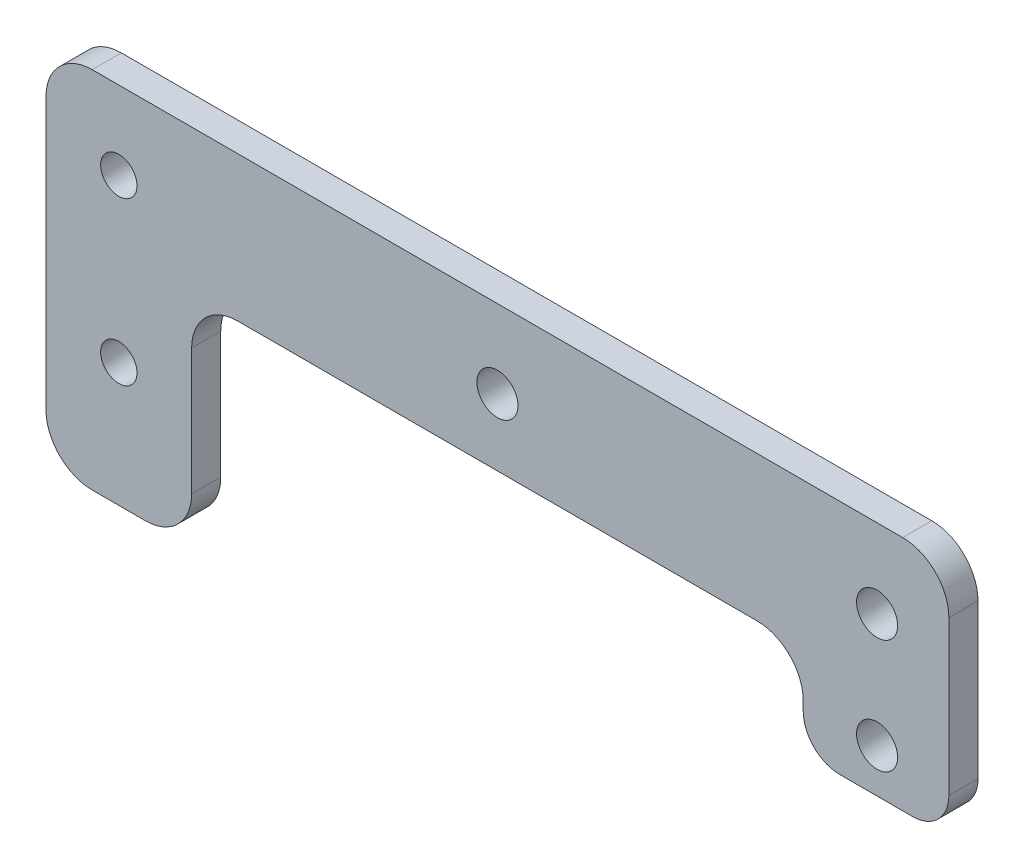
ISO-10303-21;
HEADER;
FILE_DESCRIPTION(('STEP AP214'),'2;1');
FILE_NAME('part.step','',(''),(''),'','','');
FILE_SCHEMA(('AUTOMOTIVE_DESIGN { 1 0 10303 214 1 1 1 1 }'));
ENDSEC;
DATA;
#1=APPLICATION_CONTEXT('core data for automotive mechanical design processes');
#2=APPLICATION_PROTOCOL_DEFINITION('international standard','automotive_design',2000,#1);
#3=PRODUCT_CONTEXT('',#1,'mechanical');
#4=PRODUCT('Part','Part','',(#3));
#5=PRODUCT_RELATED_PRODUCT_CATEGORY('part','',(#4));
#6=PRODUCT_DEFINITION_FORMATION('','',#4);
#7=PRODUCT_DEFINITION_CONTEXT('part definition',#1,'design');
#8=PRODUCT_DEFINITION('design','',#6,#7);
#9=PRODUCT_DEFINITION_SHAPE('','',#8);
#10=(LENGTH_UNIT() NAMED_UNIT(*) SI_UNIT(.MILLI.,.METRE.));
#11=(NAMED_UNIT(*) PLANE_ANGLE_UNIT() SI_UNIT($,.RADIAN.));
#12=(NAMED_UNIT(*) SI_UNIT($,.STERADIAN.) SOLID_ANGLE_UNIT());
#13=UNCERTAINTY_MEASURE_WITH_UNIT(LENGTH_MEASURE(1.E-05),#10,'distance_accuracy_value','');
#14=(GEOMETRIC_REPRESENTATION_CONTEXT(3) GLOBAL_UNCERTAINTY_ASSIGNED_CONTEXT((#13)) GLOBAL_UNIT_ASSIGNED_CONTEXT((#10,
#11,#12)) REPRESENTATION_CONTEXT('',''));
#15=CARTESIAN_POINT('',(0.,0.,0.));
#16=DIRECTION('',(0.,0.,1.));
#17=DIRECTION('',(1.,0.,0.));
#18=AXIS2_PLACEMENT_3D('',#15,#16,#17);
#19=CARTESIAN_POINT('',(0.,26.6043563241678,4.));
#20=DIRECTION('',(0.,1.,0.));
#21=DIRECTION('',(-1.,0.,0.));
#22=AXIS2_PLACEMENT_3D('',#19,#20,#21);
#23=PLANE('',#22);
#24=DIRECTION('',(1.,0.,0.));
#25=VECTOR('',#24,1.);
#26=CARTESIAN_POINT('',(0.,26.6043563241678,0.));
#27=LINE('',#26,#25);
#28=CARTESIAN_POINT('',(6.39337520482172,26.6043563241678,0.));
#29=VERTEX_POINT('',#28);
#30=CARTESIAN_POINT('',(117.693375204822,26.6043563241678,0.));
#31=VERTEX_POINT('',#30);
#32=EDGE_CURVE('E200',#29,#31,#27,.T.);
#33=ORIENTED_EDGE('',*,*,#32,.F.);
#34=DIRECTION('',(0.,0.,-1.));
#35=VECTOR('',#34,1.);
#36=CARTESIAN_POINT('',(6.39337520482172,26.6043563241678,4.));
#37=LINE('',#36,#35);
#38=CARTESIAN_POINT('',(6.39337520482172,26.6043563241678,4.));
#39=VERTEX_POINT('',#38);
#40=EDGE_CURVE('E11',#39,#29,#37,.T.);
#41=ORIENTED_EDGE('',*,*,#40,.F.);
#42=DIRECTION('',(1.,0.,0.));
#43=VECTOR('',#42,1.);
#44=CARTESIAN_POINT('',(0.,26.6043563241678,4.));
#45=LINE('',#44,#43);
#46=CARTESIAN_POINT('',(117.693375204822,26.6043563241678,4.));
#47=VERTEX_POINT('',#46);
#48=EDGE_CURVE('E300',#39,#47,#45,.T.);
#49=ORIENTED_EDGE('',*,*,#48,.T.);
#50=DIRECTION('',(0.,0.,-1.));
#51=VECTOR('',#50,1.);
#52=CARTESIAN_POINT('',(117.693375204822,26.6043563241678,4.));
#53=LINE('',#52,#51);
#54=EDGE_CURVE('E116',#47,#31,#53,.T.);
#55=ORIENTED_EDGE('',*,*,#54,.T.);
#56=EDGE_LOOP('',(#33,#41,#49,#55));
#57=FACE_BOUND('',#56,.T.);
#58=ADVANCED_FACE('F41',(#57),#23,.T.);
#59=CARTESIAN_POINT('',(6.39337520482172,20.2543563241678,4.));
#60=DIRECTION('',(0.,0.,-1.));
#61=DIRECTION('',(-1.,0.,0.));
#62=AXIS2_PLACEMENT_3D('',#59,#60,#61);
#63=CYLINDRICAL_SURFACE('',#62,6.35);
#64=CARTESIAN_POINT('',(6.39337520482172,20.2543563241678,0.));
#65=DIRECTION('',(0.,0.,1.));
#66=DIRECTION('',(1.,0.,0.));
#67=AXIS2_PLACEMENT_3D('',#64,#65,#66);
#68=CIRCLE('',#67,6.35);
#69=CARTESIAN_POINT('',(0.0433752048217246,20.2543563241678,0.));
#70=VERTEX_POINT('',#69);
#71=EDGE_CURVE('E203',#29,#70,#68,.T.);
#72=ORIENTED_EDGE('',*,*,#71,.T.);
#73=DIRECTION('',(0.,0.,-1.));
#74=VECTOR('',#73,1.);
#75=CARTESIAN_POINT('',(0.0433752048217246,20.2543563241678,4.));
#76=LINE('',#75,#74);
#77=CARTESIAN_POINT('',(0.0433752048217246,20.2543563241678,4.));
#78=VERTEX_POINT('',#77);
#79=EDGE_CURVE('E50',#78,#70,#76,.T.);
#80=ORIENTED_EDGE('',*,*,#79,.F.);
#81=CARTESIAN_POINT('',(6.39337520482172,20.2543563241678,4.));
#82=DIRECTION('',(0.,0.,1.));
#83=DIRECTION('',(1.,0.,0.));
#84=AXIS2_PLACEMENT_3D('',#81,#82,#83);
#85=CIRCLE('',#84,6.35);
#86=EDGE_CURVE('E296',#39,#78,#85,.T.);
#87=ORIENTED_EDGE('',*,*,#86,.F.);
#88=ORIENTED_EDGE('',*,*,#40,.T.);
#89=EDGE_LOOP('',(#72,#80,#87,#88));
#90=FACE_BOUND('',#89,.T.);
#91=ADVANCED_FACE('F283',(#90),#63,.T.);
#92=CARTESIAN_POINT('',(0.0433752048217246,0.,4.));
#93=DIRECTION('',(-1.,0.,0.));
#94=DIRECTION('',(0.,-1.,0.));
#95=AXIS2_PLACEMENT_3D('',#92,#93,#94);
#96=PLANE('',#95);
#97=DIRECTION('',(0.,1.,0.));
#98=VECTOR('',#97,1.);
#99=CARTESIAN_POINT('',(0.0433752048217246,0.,0.));
#100=LINE('',#99,#98);
#101=CARTESIAN_POINT('',(0.0433752048217247,-17.0456436758322,0.));
#102=VERTEX_POINT('',#101);
#103=EDGE_CURVE('E206',#102,#70,#100,.T.);
#104=ORIENTED_EDGE('',*,*,#103,.F.);
#105=DIRECTION('',(0.,0.,-1.));
#106=VECTOR('',#105,1.);
#107=CARTESIAN_POINT('',(0.0433752048217247,-17.0456436758322,4.));
#108=LINE('',#107,#106);
#109=CARTESIAN_POINT('',(0.0433752048217247,-17.0456436758322,4.));
#110=VERTEX_POINT('',#109);
#111=EDGE_CURVE('E273',#110,#102,#108,.T.);
#112=ORIENTED_EDGE('',*,*,#111,.F.);
#113=DIRECTION('',(0.,1.,0.));
#114=VECTOR('',#113,1.);
#115=CARTESIAN_POINT('',(0.0433752048217246,0.,4.));
#116=LINE('',#115,#114);
#117=EDGE_CURVE('E280',#110,#78,#116,.T.);
#118=ORIENTED_EDGE('',*,*,#117,.T.);
#119=ORIENTED_EDGE('',*,*,#79,.T.);
#120=EDGE_LOOP('',(#104,#112,#118,#119));
#121=FACE_BOUND('',#120,.T.);
#122=ADVANCED_FACE('F278',(#121),#96,.T.);
#123=CARTESIAN_POINT('',(6.39337520482172,-17.0456436758322,4.));
#124=DIRECTION('',(0.,0.,-1.));
#125=DIRECTION('',(-1.,0.,0.));
#126=AXIS2_PLACEMENT_3D('',#123,#124,#125);
#127=CYLINDRICAL_SURFACE('',#126,6.35);
#128=CARTESIAN_POINT('',(6.39337520482172,-17.0456436758322,0.));
#129=DIRECTION('',(0.,0.,1.));
#130=DIRECTION('',(1.,0.,0.));
#131=AXIS2_PLACEMENT_3D('',#128,#129,#130);
#132=CIRCLE('',#131,6.35);
#133=CARTESIAN_POINT('',(6.39337520482172,-23.3956436758322,0.));
#134=VERTEX_POINT('',#133);
#135=EDGE_CURVE('E209',#134,#102,#132,.F.);
#136=ORIENTED_EDGE('',*,*,#135,.F.);
#137=DIRECTION('',(0.,0.,-1.));
#138=VECTOR('',#137,1.);
#139=CARTESIAN_POINT('',(6.39337520482172,-23.3956436758322,4.));
#140=LINE('',#139,#138);
#141=CARTESIAN_POINT('',(6.39337520482172,-23.3956436758322,4.));
#142=VERTEX_POINT('',#141);
#143=EDGE_CURVE('E271',#142,#134,#140,.T.);
#144=ORIENTED_EDGE('',*,*,#143,.F.);
#145=CARTESIAN_POINT('',(6.39337520482172,-17.0456436758322,4.));
#146=DIRECTION('',(0.,0.,1.));
#147=DIRECTION('',(1.,0.,0.));
#148=AXIS2_PLACEMENT_3D('',#145,#146,#147);
#149=CIRCLE('',#148,6.35);
#150=EDGE_CURVE('E294',#142,#110,#149,.F.);
#151=ORIENTED_EDGE('',*,*,#150,.T.);
#152=ORIENTED_EDGE('',*,*,#111,.T.);
#153=EDGE_LOOP('',(#136,#144,#151,#152));
#154=FACE_BOUND('',#153,.T.);
#155=ADVANCED_FACE('F290',(#154),#127,.T.);
#156=CARTESIAN_POINT('',(0.,-23.3956436758322,4.));
#157=DIRECTION('',(0.,1.,0.));
#158=DIRECTION('',(0.,0.,1.));
#159=AXIS2_PLACEMENT_3D('',#156,#157,#158);
#160=PLANE('',#159);
#161=DIRECTION('',(1.,0.,0.));
#162=VECTOR('',#161,1.);
#163=CARTESIAN_POINT('',(0.,-23.3956436758322,0.));
#164=LINE('',#163,#162);
#165=CARTESIAN_POINT('',(13.6933752048217,-23.3956436758322,0.));
#166=VERTEX_POINT('',#165);
#167=EDGE_CURVE('E212',#134,#166,#164,.T.);
#168=ORIENTED_EDGE('',*,*,#167,.T.);
#169=DIRECTION('',(0.,0.,-1.));
#170=VECTOR('',#169,1.);
#171=CARTESIAN_POINT('',(13.6933752048217,-23.3956436758322,4.));
#172=LINE('',#171,#170);
#173=CARTESIAN_POINT('',(13.6933752048217,-23.3956436758322,4.));
#174=VERTEX_POINT('',#173);
#175=EDGE_CURVE('E268',#174,#166,#172,.T.);
#176=ORIENTED_EDGE('',*,*,#175,.F.);
#177=DIRECTION('',(1.,0.,0.));
#178=VECTOR('',#177,1.);
#179=CARTESIAN_POINT('',(0.,-23.3956436758322,4.));
#180=LINE('',#179,#178);
#181=EDGE_CURVE('E298',#142,#174,#180,.T.);
#182=ORIENTED_EDGE('',*,*,#181,.F.);
#183=ORIENTED_EDGE('',*,*,#143,.T.);
#184=EDGE_LOOP('',(#168,#176,#182,#183));
#185=FACE_BOUND('',#184,.T.);
#186=ADVANCED_FACE('F423',(#185),#160,.F.);
#187=CARTESIAN_POINT('',(13.6933752048217,-17.0456436758322,4.));
#188=DIRECTION('',(0.,0.,-1.));
#189=DIRECTION('',(-1.,0.,0.));
#190=AXIS2_PLACEMENT_3D('',#187,#188,#189);
#191=CYLINDRICAL_SURFACE('',#190,6.35);
#192=CARTESIAN_POINT('',(13.6933752048217,-17.0456436758322,0.));
#193=DIRECTION('',(0.,0.,1.));
#194=DIRECTION('',(1.,0.,0.));
#195=AXIS2_PLACEMENT_3D('',#192,#193,#194);
#196=CIRCLE('',#195,6.35);
#197=CARTESIAN_POINT('',(20.0433752048217,-17.0456436758322,0.));
#198=VERTEX_POINT('',#197);
#199=EDGE_CURVE('E215',#166,#198,#196,.T.);
#200=ORIENTED_EDGE('',*,*,#199,.T.);
#201=DIRECTION('',(0.,0.,-1.));
#202=VECTOR('',#201,1.);
#203=CARTESIAN_POINT('',(20.0433752048217,-17.0456436758322,4.));
#204=LINE('',#203,#202);
#205=CARTESIAN_POINT('',(20.0433752048217,-17.0456436758322,4.));
#206=VERTEX_POINT('',#205);
#207=EDGE_CURVE('E266',#206,#198,#204,.T.);
#208=ORIENTED_EDGE('',*,*,#207,.F.);
#209=CARTESIAN_POINT('',(13.6933752048217,-17.0456436758322,4.));
#210=DIRECTION('',(0.,0.,1.));
#211=DIRECTION('',(1.,0.,0.));
#212=AXIS2_PLACEMENT_3D('',#209,#210,#211);
#213=CIRCLE('',#212,6.35);
#214=EDGE_CURVE('E305',#174,#206,#213,.T.);
#215=ORIENTED_EDGE('',*,*,#214,.F.);
#216=ORIENTED_EDGE('',*,*,#175,.T.);
#217=EDGE_LOOP('',(#200,#208,#215,#216));
#218=FACE_BOUND('',#217,.T.);
#219=ADVANCED_FACE('F419',(#218),#191,.T.);
#220=CARTESIAN_POINT('',(20.0433752048217,0.,4.));
#221=DIRECTION('',(1.,0.,0.));
#222=DIRECTION('',(0.,1.,0.));
#223=AXIS2_PLACEMENT_3D('',#220,#221,#222);
#224=PLANE('',#223);
#225=DIRECTION('',(0.,-1.,0.));
#226=VECTOR('',#225,1.);
#227=CARTESIAN_POINT('',(20.0433752048217,0.,0.));
#228=LINE('',#227,#226);
#229=CARTESIAN_POINT('',(20.0433752048217,0.349416953919621,0.));
#230=VERTEX_POINT('',#229);
#231=EDGE_CURVE('E218',#230,#198,#228,.T.);
#232=ORIENTED_EDGE('',*,*,#231,.F.);
#233=DIRECTION('',(0.,0.,-1.));
#234=VECTOR('',#233,1.);
#235=CARTESIAN_POINT('',(20.0433752048217,0.349416953919621,4.));
#236=LINE('',#235,#234);
#237=CARTESIAN_POINT('',(20.0433752048217,0.349416953919621,4.));
#238=VERTEX_POINT('',#237);
#239=EDGE_CURVE('E264',#238,#230,#236,.T.);
#240=ORIENTED_EDGE('',*,*,#239,.F.);
#241=DIRECTION('',(0.,-1.,0.));
#242=VECTOR('',#241,1.);
#243=CARTESIAN_POINT('',(20.0433752048217,0.,4.));
#244=LINE('',#243,#242);
#245=EDGE_CURVE('E307',#238,#206,#244,.T.);
#246=ORIENTED_EDGE('',*,*,#245,.T.);
#247=ORIENTED_EDGE('',*,*,#207,.T.);
#248=EDGE_LOOP('',(#232,#240,#246,#247));
#249=FACE_BOUND('',#248,.T.);
#250=ADVANCED_FACE('F415',(#249),#224,.T.);
#251=CARTESIAN_POINT('',(26.3933752048217,0.349416953919621,4.));
#252=DIRECTION('',(0.,0.,-1.));
#253=DIRECTION('',(-1.,0.,0.));
#254=AXIS2_PLACEMENT_3D('',#251,#252,#253);
#255=CYLINDRICAL_SURFACE('',#254,6.35);
#256=CARTESIAN_POINT('',(26.3933752048217,0.349416953919621,0.));
#257=DIRECTION('',(0.,0.,1.));
#258=DIRECTION('',(1.,0.,0.));
#259=AXIS2_PLACEMENT_3D('',#256,#257,#258);
#260=CIRCLE('',#259,6.35);
#261=CARTESIAN_POINT('',(26.3933752048217,6.69941695391962,0.));
#262=VERTEX_POINT('',#261);
#263=EDGE_CURVE('E221',#262,#230,#260,.T.);
#264=ORIENTED_EDGE('',*,*,#263,.F.);
#265=DIRECTION('',(0.,0.,-1.));
#266=VECTOR('',#265,1.);
#267=CARTESIAN_POINT('',(26.3933752048217,6.69941695391962,4.));
#268=LINE('',#267,#266);
#269=CARTESIAN_POINT('',(26.3933752048217,6.69941695391962,4.));
#270=VERTEX_POINT('',#269);
#271=EDGE_CURVE('E262',#270,#262,#268,.T.);
#272=ORIENTED_EDGE('',*,*,#271,.F.);
#273=CARTESIAN_POINT('',(26.3933752048217,0.349416953919621,4.));
#274=DIRECTION('',(0.,0.,1.));
#275=DIRECTION('',(1.,0.,0.));
#276=AXIS2_PLACEMENT_3D('',#273,#274,#275);
#277=CIRCLE('',#276,6.35);
#278=EDGE_CURVE('E310',#270,#238,#277,.T.);
#279=ORIENTED_EDGE('',*,*,#278,.T.);
#280=ORIENTED_EDGE('',*,*,#239,.T.);
#281=EDGE_LOOP('',(#264,#272,#279,#280));
#282=FACE_BOUND('',#281,.T.);
#283=ADVANCED_FACE('F411',(#282),#255,.F.);
#284=CARTESIAN_POINT('',(0.,6.69941695391962,4.));
#285=DIRECTION('',(0.,1.,0.));
#286=DIRECTION('',(0.,0.,1.));
#287=AXIS2_PLACEMENT_3D('',#284,#285,#286);
#288=PLANE('',#287);
#289=DIRECTION('',(1.,0.,0.));
#290=VECTOR('',#289,1.);
#291=CARTESIAN_POINT('',(0.,6.69941695391962,0.));
#292=LINE('',#291,#290);
#293=CARTESIAN_POINT('',(97.6933752048217,6.69941695391962,0.));
#294=VERTEX_POINT('',#293);
#295=EDGE_CURVE('E224',#262,#294,#292,.T.);
#296=ORIENTED_EDGE('',*,*,#295,.T.);
#297=DIRECTION('',(0.,0.,-1.));
#298=VECTOR('',#297,1.);
#299=CARTESIAN_POINT('',(97.6933752048217,6.69941695391962,4.));
#300=LINE('',#299,#298);
#301=CARTESIAN_POINT('',(97.6933752048217,6.69941695391962,4.));
#302=VERTEX_POINT('',#301);
#303=EDGE_CURVE('E260',#302,#294,#300,.T.);
#304=ORIENTED_EDGE('',*,*,#303,.F.);
#305=DIRECTION('',(1.,0.,0.));
#306=VECTOR('',#305,1.);
#307=CARTESIAN_POINT('',(0.,6.69941695391962,4.));
#308=LINE('',#307,#306);
#309=EDGE_CURVE('E313',#270,#302,#308,.T.);
#310=ORIENTED_EDGE('',*,*,#309,.F.);
#311=ORIENTED_EDGE('',*,*,#271,.T.);
#312=EDGE_LOOP('',(#296,#304,#310,#311));
#313=FACE_BOUND('',#312,.T.);
#314=ADVANCED_FACE('F407',(#313),#288,.F.);
#315=CARTESIAN_POINT('',(97.6933752048217,0.349416953919621,4.));
#316=DIRECTION('',(0.,0.,-1.));
#317=DIRECTION('',(-1.,0.,0.));
#318=AXIS2_PLACEMENT_3D('',#315,#316,#317);
#319=CYLINDRICAL_SURFACE('',#318,6.35);
#320=CARTESIAN_POINT('',(97.6933752048217,0.349416953919621,0.));
#321=DIRECTION('',(0.,0.,1.));
#322=DIRECTION('',(1.,0.,0.));
#323=AXIS2_PLACEMENT_3D('',#320,#321,#322);
#324=CIRCLE('',#323,6.35);
#325=CARTESIAN_POINT('',(104.043375204822,0.349416953919631,0.));
#326=VERTEX_POINT('',#325);
#327=EDGE_CURVE('E227',#326,#294,#324,.T.);
#328=ORIENTED_EDGE('',*,*,#327,.F.);
#329=DIRECTION('',(0.,0.,-1.));
#330=VECTOR('',#329,1.);
#331=CARTESIAN_POINT('',(104.043375204822,0.349416953919631,4.));
#332=LINE('',#331,#330);
#333=CARTESIAN_POINT('',(104.043375204822,0.349416953919631,4.));
#334=VERTEX_POINT('',#333);
#335=EDGE_CURVE('E258',#334,#326,#332,.T.);
#336=ORIENTED_EDGE('',*,*,#335,.F.);
#337=CARTESIAN_POINT('',(97.6933752048217,0.349416953919621,4.));
#338=DIRECTION('',(0.,0.,1.));
#339=DIRECTION('',(1.,0.,0.));
#340=AXIS2_PLACEMENT_3D('',#337,#338,#339);
#341=CIRCLE('',#340,6.35);
#342=EDGE_CURVE('E315',#334,#302,#341,.T.);
#343=ORIENTED_EDGE('',*,*,#342,.T.);
#344=ORIENTED_EDGE('',*,*,#303,.T.);
#345=EDGE_LOOP('',(#328,#336,#343,#344));
#346=FACE_BOUND('',#345,.T.);
#347=ADVANCED_FACE('F403',(#346),#319,.F.);
#348=CARTESIAN_POINT('',(104.043375204822,0.,4.));
#349=DIRECTION('',(-1.,0.,0.));
#350=DIRECTION('',(0.,0.,1.));
#351=AXIS2_PLACEMENT_3D('',#348,#349,#350);
#352=PLANE('',#351);
#353=DIRECTION('',(0.,1.,0.));
#354=VECTOR('',#353,1.);
#355=CARTESIAN_POINT('',(104.043375204822,0.,0.));
#356=LINE('',#355,#354);
#357=CARTESIAN_POINT('',(104.043375204822,-0.895643675832241,0.));
#358=VERTEX_POINT('',#357);
#359=EDGE_CURVE('E230',#358,#326,#356,.T.);
#360=ORIENTED_EDGE('',*,*,#359,.F.);
#361=DIRECTION('',(0.,0.,-1.));
#362=VECTOR('',#361,1.);
#363=CARTESIAN_POINT('',(104.043375204822,-0.895643675832241,4.));
#364=LINE('',#363,#362);
#365=CARTESIAN_POINT('',(104.043375204822,-0.895643675832241,4.));
#366=VERTEX_POINT('',#365);
#367=EDGE_CURVE('E256',#366,#358,#364,.T.);
#368=ORIENTED_EDGE('',*,*,#367,.F.);
#369=DIRECTION('',(0.,1.,0.));
#370=VECTOR('',#369,1.);
#371=CARTESIAN_POINT('',(104.043375204822,0.,4.));
#372=LINE('',#371,#370);
#373=EDGE_CURVE('E318',#366,#334,#372,.T.);
#374=ORIENTED_EDGE('',*,*,#373,.T.);
#375=ORIENTED_EDGE('',*,*,#335,.T.);
#376=EDGE_LOOP('',(#360,#368,#374,#375));
#377=FACE_BOUND('',#376,.T.);
#378=ADVANCED_FACE('F399',(#377),#352,.T.);
#379=CARTESIAN_POINT('',(109.043375204822,-0.895643675832241,4.));
#380=DIRECTION('',(0.,0.,-1.));
#381=DIRECTION('',(-1.,0.,0.));
#382=AXIS2_PLACEMENT_3D('',#379,#380,#381);
#383=CYLINDRICAL_SURFACE('',#382,5.);
#384=CARTESIAN_POINT('',(109.043375204822,-0.895643675832241,0.));
#385=DIRECTION('',(0.,0.,1.));
#386=DIRECTION('',(1.,0.,0.));
#387=AXIS2_PLACEMENT_3D('',#384,#385,#386);
#388=CIRCLE('',#387,5.);
#389=CARTESIAN_POINT('',(109.043375204822,-5.89564367583224,0.));
#390=VERTEX_POINT('',#389);
#391=EDGE_CURVE('E233',#390,#358,#388,.F.);
#392=ORIENTED_EDGE('',*,*,#391,.F.);
#393=DIRECTION('',(0.,0.,-1.));
#394=VECTOR('',#393,1.);
#395=CARTESIAN_POINT('',(109.043375204822,-5.89564367583224,4.));
#396=LINE('',#395,#394);
#397=CARTESIAN_POINT('',(109.043375204822,-5.89564367583224,4.));
#398=VERTEX_POINT('',#397);
#399=EDGE_CURVE('E254',#398,#390,#396,.T.);
#400=ORIENTED_EDGE('',*,*,#399,.F.);
#401=CARTESIAN_POINT('',(109.043375204822,-0.895643675832241,4.));
#402=DIRECTION('',(0.,0.,1.));
#403=DIRECTION('',(1.,0.,0.));
#404=AXIS2_PLACEMENT_3D('',#401,#402,#403);
#405=CIRCLE('',#404,5.);
#406=EDGE_CURVE('E321',#398,#366,#405,.F.);
#407=ORIENTED_EDGE('',*,*,#406,.T.);
#408=ORIENTED_EDGE('',*,*,#367,.T.);
#409=EDGE_LOOP('',(#392,#400,#407,#408));
#410=FACE_BOUND('',#409,.T.);
#411=ADVANCED_FACE('F396',(#410),#383,.T.);
#412=CARTESIAN_POINT('',(0.,-5.89564367583225,4.));
#413=DIRECTION('',(0.,-1.,0.));
#414=DIRECTION('',(1.,0.,0.));
#415=AXIS2_PLACEMENT_3D('',#412,#413,#414);
#416=PLANE('',#415);
#417=DIRECTION('',(-1.,0.,0.));
#418=VECTOR('',#417,1.);
#419=CARTESIAN_POINT('',(0.,-5.89564367583225,0.));
#420=LINE('',#419,#418);
#421=CARTESIAN_POINT('',(119.043375204822,-5.89564367583224,0.));
#422=VERTEX_POINT('',#421);
#423=EDGE_CURVE('E236',#422,#390,#420,.T.);
#424=ORIENTED_EDGE('',*,*,#423,.F.);
#425=DIRECTION('',(0.,0.,-1.));
#426=VECTOR('',#425,1.);
#427=CARTESIAN_POINT('',(119.043375204822,-5.89564367583224,4.));
#428=LINE('',#427,#426);
#429=CARTESIAN_POINT('',(119.043375204822,-5.89564367583224,4.));
#430=VERTEX_POINT('',#429);
#431=EDGE_CURVE('E178',#430,#422,#428,.T.);
#432=ORIENTED_EDGE('',*,*,#431,.F.);
#433=DIRECTION('',(-1.,0.,0.));
#434=VECTOR('',#433,1.);
#435=CARTESIAN_POINT('',(0.,-5.89564367583225,4.));
#436=LINE('',#435,#434);
#437=EDGE_CURVE('E167',#430,#398,#436,.T.);
#438=ORIENTED_EDGE('',*,*,#437,.T.);
#439=ORIENTED_EDGE('',*,*,#399,.T.);
#440=EDGE_LOOP('',(#424,#432,#438,#439));
#441=FACE_BOUND('',#440,.T.);
#442=ADVANCED_FACE('F325',(#441),#416,.T.);
#443=CARTESIAN_POINT('',(119.043375204822,-0.89564367583224,4.));
#444=DIRECTION('',(0.,0.,-1.));
#445=DIRECTION('',(-1.,0.,0.));
#446=AXIS2_PLACEMENT_3D('',#443,#444,#445);
#447=CYLINDRICAL_SURFACE('',#446,5.);
#448=CARTESIAN_POINT('',(119.043375204822,-0.89564367583224,0.));
#449=DIRECTION('',(0.,0.,1.));
#450=DIRECTION('',(1.,0.,0.));
#451=AXIS2_PLACEMENT_3D('',#448,#449,#450);
#452=CIRCLE('',#451,5.);
#453=CARTESIAN_POINT('',(124.043375204822,-0.895643675832239,0.));
#454=VERTEX_POINT('',#453);
#455=EDGE_CURVE('E174',#422,#454,#452,.T.);
#456=ORIENTED_EDGE('',*,*,#455,.T.);
#457=DIRECTION('',(0.,0.,-1.));
#458=VECTOR('',#457,1.);
#459=CARTESIAN_POINT('',(124.043375204822,-0.895643675832239,4.));
#460=LINE('',#459,#458);
#461=CARTESIAN_POINT('',(124.043375204822,-0.895643675832239,4.));
#462=VERTEX_POINT('',#461);
#463=EDGE_CURVE('E171',#462,#454,#460,.T.);
#464=ORIENTED_EDGE('',*,*,#463,.F.);
#465=CARTESIAN_POINT('',(119.043375204822,-0.89564367583224,4.));
#466=DIRECTION('',(0.,0.,1.));
#467=DIRECTION('',(1.,0.,0.));
#468=AXIS2_PLACEMENT_3D('',#465,#466,#467);
#469=CIRCLE('',#468,5.);
#470=EDGE_CURVE('E159',#430,#462,#469,.T.);
#471=ORIENTED_EDGE('',*,*,#470,.F.);
#472=ORIENTED_EDGE('',*,*,#431,.T.);
#473=EDGE_LOOP('',(#456,#464,#471,#472));
#474=FACE_BOUND('',#473,.T.);
#475=ADVANCED_FACE('F172',(#474),#447,.T.);
#476=CARTESIAN_POINT('',(124.043375204822,0.,4.));
#477=DIRECTION('',(1.,0.,0.));
#478=DIRECTION('',(0.,0.,-1.));
#479=AXIS2_PLACEMENT_3D('',#476,#477,#478);
#480=PLANE('',#479);
#481=DIRECTION('',(0.,-1.,0.));
#482=VECTOR('',#481,1.);
#483=CARTESIAN_POINT('',(124.043375204822,0.,0.));
#484=LINE('',#483,#482);
#485=CARTESIAN_POINT('',(124.043375204822,20.2543563241678,0.));
#486=VERTEX_POINT('',#485);
#487=EDGE_CURVE('E240',#486,#454,#484,.T.);
#488=ORIENTED_EDGE('',*,*,#487,.F.);
#489=DIRECTION('',(0.,0.,-1.));
#490=VECTOR('',#489,1.);
#491=CARTESIAN_POINT('',(124.043375204822,20.2543563241678,4.));
#492=LINE('',#491,#490);
#493=CARTESIAN_POINT('',(124.043375204822,20.2543563241678,4.));
#494=VERTEX_POINT('',#493);
#495=EDGE_CURVE('E109',#494,#486,#492,.T.);
#496=ORIENTED_EDGE('',*,*,#495,.F.);
#497=DIRECTION('',(0.,-1.,0.));
#498=VECTOR('',#497,1.);
#499=CARTESIAN_POINT('',(124.043375204822,0.,4.));
#500=LINE('',#499,#498);
#501=EDGE_CURVE('E164',#494,#462,#500,.T.);
#502=ORIENTED_EDGE('',*,*,#501,.T.);
#503=ORIENTED_EDGE('',*,*,#463,.T.);
#504=EDGE_LOOP('',(#488,#496,#502,#503));
#505=FACE_BOUND('',#504,.T.);
#506=ADVANCED_FACE('F180',(#505),#480,.T.);
#507=CARTESIAN_POINT('',(10.0433752048217,-6.39564367583229,4.));
#508=DIRECTION('',(0.,0.,-1.));
#509=DIRECTION('',(-1.,0.,0.));
#510=AXIS2_PLACEMENT_3D('',#507,#508,#509);
#511=CYLINDRICAL_SURFACE('',#510,2.5);
#512=CARTESIAN_POINT('',(10.0433752048217,-6.39564367583229,4.));
#513=DIRECTION('',(0.,0.,1.));
#514=DIRECTION('',(1.,0.,0.));
#515=AXIS2_PLACEMENT_3D('',#512,#513,#514);
#516=CIRCLE('',#515,2.5);
#517=CARTESIAN_POINT('',(12.5433752048217,-6.39564367583229,4.));
#518=VERTEX_POINT('',#517);
#519=EDGE_CURVE('E182',#518,#518,#516,.T.);
#520=ORIENTED_EDGE('',*,*,#519,.T.);
#521=EDGE_LOOP('',(#520));
#522=FACE_BOUND('',#521,.T.);
#523=CARTESIAN_POINT('',(10.0433752048217,-6.39564367583229,0.));
#524=DIRECTION('',(0.,0.,1.));
#525=DIRECTION('',(1.,0.,0.));
#526=AXIS2_PLACEMENT_3D('',#523,#524,#525);
#527=CIRCLE('',#526,2.5);
#528=CARTESIAN_POINT('',(12.5433752048217,-6.39564367583229,0.));
#529=VERTEX_POINT('',#528);
#530=EDGE_CURVE('E244',#529,#529,#527,.T.);
#531=ORIENTED_EDGE('',*,*,#530,.F.);
#532=EDGE_LOOP('',(#531));
#533=FACE_BOUND('',#532,.T.);
#534=ADVANCED_FACE('F384',(#522,#533),#511,.F.);
#535=CARTESIAN_POINT('',(117.693375204822,20.2543563241678,4.));
#536=DIRECTION('',(0.,0.,-1.));
#537=DIRECTION('',(-1.,0.,0.));
#538=AXIS2_PLACEMENT_3D('',#535,#536,#537);
#539=CYLINDRICAL_SURFACE('',#538,6.35);
#540=CARTESIAN_POINT('',(117.693375204822,20.2543563241678,0.));
#541=DIRECTION('',(0.,0.,1.));
#542=DIRECTION('',(1.,0.,0.));
#543=AXIS2_PLACEMENT_3D('',#540,#541,#542);
#544=CIRCLE('',#543,6.35);
#545=EDGE_CURVE('E242',#486,#31,#544,.T.);
#546=ORIENTED_EDGE('',*,*,#545,.T.);
#547=ORIENTED_EDGE('',*,*,#54,.F.);
#548=CARTESIAN_POINT('',(117.693375204822,20.2543563241678,4.));
#549=DIRECTION('',(0.,0.,1.));
#550=DIRECTION('',(1.,0.,0.));
#551=AXIS2_PLACEMENT_3D('',#548,#549,#550);
#552=CIRCLE('',#551,6.35);
#553=EDGE_CURVE('E58',#494,#47,#552,.T.);
#554=ORIENTED_EDGE('',*,*,#553,.F.);
#555=ORIENTED_EDGE('',*,*,#495,.T.);
#556=EDGE_LOOP('',(#546,#547,#554,#555));
#557=FACE_BOUND('',#556,.T.);
#558=ADVANCED_FACE('F327',(#557),#539,.T.);
#559=CARTESIAN_POINT('',(114.183375204822,0.104356324167762,4.));
#560=DIRECTION('',(0.,0.,-1.));
#561=DIRECTION('',(-1.,0.,0.));
#562=AXIS2_PLACEMENT_3D('',#559,#560,#561);
#563=CYLINDRICAL_SURFACE('',#562,2.8213685039973);
#564=CARTESIAN_POINT('',(114.183375204822,0.104356324167762,4.));
#565=DIRECTION('',(0.,0.,1.));
#566=DIRECTION('',(1.,0.,0.));
#567=AXIS2_PLACEMENT_3D('',#564,#565,#566);
#568=CIRCLE('',#567,2.8213685039973);
#569=CARTESIAN_POINT('',(117.004743708819,0.104356324167762,4.));
#570=VERTEX_POINT('',#569);
#571=EDGE_CURVE('E328',#570,#570,#568,.T.);
#572=ORIENTED_EDGE('',*,*,#571,.T.);
#573=EDGE_LOOP('',(#572));
#574=FACE_BOUND('',#573,.T.);
#575=CARTESIAN_POINT('',(114.183375204822,0.104356324167762,0.));
#576=DIRECTION('',(0.,0.,1.));
#577=DIRECTION('',(1.,0.,0.));
#578=AXIS2_PLACEMENT_3D('',#575,#576,#577);
#579=CIRCLE('',#578,2.8213685039973);
#580=CARTESIAN_POINT('',(117.004743708819,0.104356324167762,0.));
#581=VERTEX_POINT('',#580);
#582=EDGE_CURVE('E197',#581,#581,#579,.T.);
#583=ORIENTED_EDGE('',*,*,#582,.F.);
#584=EDGE_LOOP('',(#583));
#585=FACE_BOUND('',#584,.T.);
#586=ADVANCED_FACE('F348',(#574,#585),#563,.F.);
#587=CARTESIAN_POINT('',(114.183375204822,15.771437703016,4.));
#588=DIRECTION('',(0.,0.,-1.));
#589=DIRECTION('',(-1.,0.,0.));
#590=AXIS2_PLACEMENT_3D('',#587,#588,#589);
#591=CYLINDRICAL_SURFACE('',#590,2.82136850399728);
#592=CARTESIAN_POINT('',(114.183375204822,15.771437703016,4.));
#593=DIRECTION('',(0.,0.,1.));
#594=DIRECTION('',(1.,0.,0.));
#595=AXIS2_PLACEMENT_3D('',#592,#593,#594);
#596=CIRCLE('',#595,2.82136850399728);
#597=CARTESIAN_POINT('',(117.004743708819,15.771437703016,4.));
#598=VERTEX_POINT('',#597);
#599=EDGE_CURVE('E330',#598,#598,#596,.T.);
#600=ORIENTED_EDGE('',*,*,#599,.T.);
#601=EDGE_LOOP('',(#600));
#602=FACE_BOUND('',#601,.T.);
#603=CARTESIAN_POINT('',(114.183375204822,15.771437703016,0.));
#604=DIRECTION('',(0.,0.,1.));
#605=DIRECTION('',(1.,0.,0.));
#606=AXIS2_PLACEMENT_3D('',#603,#604,#605);
#607=CIRCLE('',#606,2.82136850399728);
#608=CARTESIAN_POINT('',(117.004743708819,15.771437703016,0.));
#609=VERTEX_POINT('',#608);
#610=EDGE_CURVE('E194',#609,#609,#607,.T.);
#611=ORIENTED_EDGE('',*,*,#610,.F.);
#612=EDGE_LOOP('',(#611));
#613=FACE_BOUND('',#612,.T.);
#614=ADVANCED_FACE('F351',(#602,#613),#591,.F.);
#615=CARTESIAN_POINT('',(62.0433752048217,15.8664983327679,4.));
#616=DIRECTION('',(0.,0.,-1.));
#617=DIRECTION('',(-1.,0.,0.));
#618=AXIS2_PLACEMENT_3D('',#615,#616,#617);
#619=CYLINDRICAL_SURFACE('',#618,2.8213685039973);
#620=CARTESIAN_POINT('',(62.0433752048217,15.8664983327679,4.));
#621=DIRECTION('',(0.,0.,1.));
#622=DIRECTION('',(1.,0.,0.));
#623=AXIS2_PLACEMENT_3D('',#620,#621,#622);
#624=CIRCLE('',#623,2.8213685039973);
#625=CARTESIAN_POINT('',(64.864743708819,15.8664983327679,4.));
#626=VERTEX_POINT('',#625);
#627=EDGE_CURVE('E250',#626,#626,#624,.T.);
#628=ORIENTED_EDGE('',*,*,#627,.T.);
#629=EDGE_LOOP('',(#628));
#630=FACE_BOUND('',#629,.T.);
#631=CARTESIAN_POINT('',(62.0433752048217,15.8664983327679,0.));
#632=DIRECTION('',(0.,0.,1.));
#633=DIRECTION('',(1.,0.,0.));
#634=AXIS2_PLACEMENT_3D('',#631,#632,#633);
#635=CIRCLE('',#634,2.8213685039973);
#636=CARTESIAN_POINT('',(64.864743708819,15.8664983327679,0.));
#637=VERTEX_POINT('',#636);
#638=EDGE_CURVE('E191',#637,#637,#635,.T.);
#639=ORIENTED_EDGE('',*,*,#638,.F.);
#640=EDGE_LOOP('',(#639));
#641=FACE_BOUND('',#640,.T.);
#642=ADVANCED_FACE('F43',(#630,#641),#619,.F.);
#643=CARTESIAN_POINT('',(10.0433752048217,15.8664983327679,4.));
#644=DIRECTION('',(0.,0.,-1.));
#645=DIRECTION('',(-1.,0.,0.));
#646=AXIS2_PLACEMENT_3D('',#643,#644,#645);
#647=CYLINDRICAL_SURFACE('',#646,2.5);
#648=CARTESIAN_POINT('',(10.0433752048217,15.8664983327679,4.));
#649=DIRECTION('',(0.,0.,1.));
#650=DIRECTION('',(1.,0.,0.));
#651=AXIS2_PLACEMENT_3D('',#648,#649,#650);
#652=CIRCLE('',#651,2.5);
#653=CARTESIAN_POINT('',(12.5433752048217,15.8664983327679,4.));
#654=VERTEX_POINT('',#653);
#655=EDGE_CURVE('E188',#654,#654,#652,.T.);
#656=ORIENTED_EDGE('',*,*,#655,.T.);
#657=EDGE_LOOP('',(#656));
#658=FACE_BOUND('',#657,.T.);
#659=CARTESIAN_POINT('',(10.0433752048217,15.8664983327679,0.));
#660=DIRECTION('',(0.,0.,1.));
#661=DIRECTION('',(1.,0.,0.));
#662=AXIS2_PLACEMENT_3D('',#659,#660,#661);
#663=CIRCLE('',#662,2.5);
#664=CARTESIAN_POINT('',(12.5433752048217,15.8664983327679,0.));
#665=VERTEX_POINT('',#664);
#666=EDGE_CURVE('E247',#665,#665,#663,.T.);
#667=ORIENTED_EDGE('',*,*,#666,.F.);
#668=EDGE_LOOP('',(#667));
#669=FACE_BOUND('',#668,.T.);
#670=ADVANCED_FACE('F342',(#658,#669),#647,.F.);
#671=CARTESIAN_POINT('',(0.,0.,4.));
#672=DIRECTION('',(0.,0.,1.));
#673=DIRECTION('',(1.,0.,0.));
#674=AXIS2_PLACEMENT_3D('',#671,#672,#673);
#675=PLANE('',#674);
#676=ORIENTED_EDGE('',*,*,#627,.F.);
#677=EDGE_LOOP('',(#676));
#678=FACE_BOUND('',#677,.T.);
#679=ORIENTED_EDGE('',*,*,#599,.F.);
#680=EDGE_LOOP('',(#679));
#681=FACE_BOUND('',#680,.T.);
#682=ORIENTED_EDGE('',*,*,#571,.F.);
#683=EDGE_LOOP('',(#682));
#684=FACE_BOUND('',#683,.T.);
#685=ORIENTED_EDGE('',*,*,#48,.F.);
#686=ORIENTED_EDGE('',*,*,#86,.T.);
#687=ORIENTED_EDGE('',*,*,#117,.F.);
#688=ORIENTED_EDGE('',*,*,#150,.F.);
#689=ORIENTED_EDGE('',*,*,#181,.T.);
#690=ORIENTED_EDGE('',*,*,#214,.T.);
#691=ORIENTED_EDGE('',*,*,#245,.F.);
#692=ORIENTED_EDGE('',*,*,#278,.F.);
#693=ORIENTED_EDGE('',*,*,#309,.T.);
#694=ORIENTED_EDGE('',*,*,#342,.F.);
#695=ORIENTED_EDGE('',*,*,#373,.F.);
#696=ORIENTED_EDGE('',*,*,#406,.F.);
#697=ORIENTED_EDGE('',*,*,#437,.F.);
#698=ORIENTED_EDGE('',*,*,#470,.T.);
#699=ORIENTED_EDGE('',*,*,#501,.F.);
#700=ORIENTED_EDGE('',*,*,#553,.T.);
#701=EDGE_LOOP('',(#685,#686,#687,#688,#689,#690,#691,#692,#693,#694,#695,#696,#697,#698,#699,#700));
#702=FACE_BOUND('',#701,.T.);
#703=ORIENTED_EDGE('',*,*,#519,.F.);
#704=EDGE_LOOP('',(#703));
#705=FACE_BOUND('',#704,.T.);
#706=ORIENTED_EDGE('',*,*,#655,.F.);
#707=EDGE_LOOP('',(#706));
#708=FACE_BOUND('',#707,.T.);
#709=ADVANCED_FACE('F161',(#678,#681,#684,#702,#705,#708),#675,.T.);
#710=CARTESIAN_POINT('',(0.,0.,0.));
#711=DIRECTION('',(0.,0.,1.));
#712=DIRECTION('',(1.,0.,0.));
#713=AXIS2_PLACEMENT_3D('',#710,#711,#712);
#714=PLANE('',#713);
#715=ORIENTED_EDGE('',*,*,#638,.T.);
#716=EDGE_LOOP('',(#715));
#717=FACE_BOUND('',#716,.T.);
#718=ORIENTED_EDGE('',*,*,#610,.T.);
#719=EDGE_LOOP('',(#718));
#720=FACE_BOUND('',#719,.T.);
#721=ORIENTED_EDGE('',*,*,#582,.T.);
#722=EDGE_LOOP('',(#721));
#723=FACE_BOUND('',#722,.T.);
#724=ORIENTED_EDGE('',*,*,#32,.T.);
#725=ORIENTED_EDGE('',*,*,#545,.F.);
#726=ORIENTED_EDGE('',*,*,#487,.T.);
#727=ORIENTED_EDGE('',*,*,#455,.F.);
#728=ORIENTED_EDGE('',*,*,#423,.T.);
#729=ORIENTED_EDGE('',*,*,#391,.T.);
#730=ORIENTED_EDGE('',*,*,#359,.T.);
#731=ORIENTED_EDGE('',*,*,#327,.T.);
#732=ORIENTED_EDGE('',*,*,#295,.F.);
#733=ORIENTED_EDGE('',*,*,#263,.T.);
#734=ORIENTED_EDGE('',*,*,#231,.T.);
#735=ORIENTED_EDGE('',*,*,#199,.F.);
#736=ORIENTED_EDGE('',*,*,#167,.F.);
#737=ORIENTED_EDGE('',*,*,#135,.T.);
#738=ORIENTED_EDGE('',*,*,#103,.T.);
#739=ORIENTED_EDGE('',*,*,#71,.F.);
#740=EDGE_LOOP('',(#724,#725,#726,#727,#728,#729,#730,#731,#732,#733,#734,#735,#736,#737,#738,#739));
#741=FACE_BOUND('',#740,.T.);
#742=ORIENTED_EDGE('',*,*,#530,.T.);
#743=EDGE_LOOP('',(#742));
#744=FACE_BOUND('',#743,.T.);
#745=ORIENTED_EDGE('',*,*,#666,.T.);
#746=EDGE_LOOP('',(#745));
#747=FACE_BOUND('',#746,.T.);
#748=ADVANCED_FACE('F285',(#717,#720,#723,#741,#744,#747),#714,.F.);
#749=CLOSED_SHELL('',(#58,#91,#122,#155,#186,#219,#250,#283,#314,#347,#378,#411,#442,#475,#506,
#534,#558,#586,#614,#642,#670,#709,#748));
#750=MANIFOLD_SOLID_BREP('B2',#749);
#751=ADVANCED_BREP_SHAPE_REPRESENTATION('',(#18,#750),#14);
#752=SHAPE_DEFINITION_REPRESENTATION(#9,#751);
ENDSEC;
END-ISO-10303-21;
